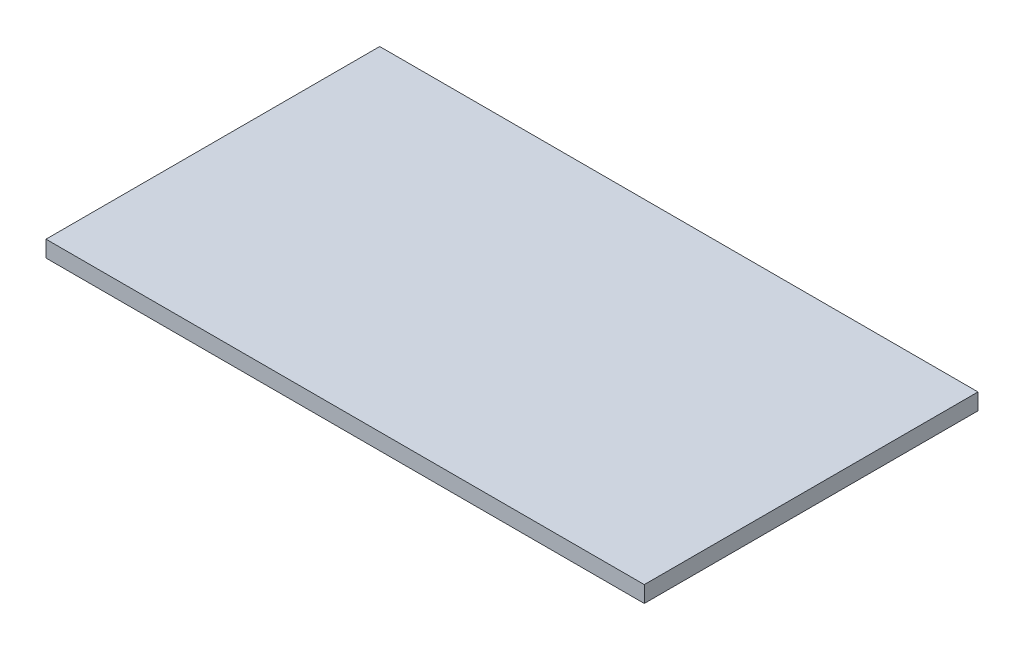
ISO-10303-21;
HEADER;
FILE_DESCRIPTION(('STEP AP214'),'2;1');
FILE_NAME('part.step','',(''),(''),'','','');
FILE_SCHEMA(('AUTOMOTIVE_DESIGN { 1 0 10303 214 1 1 1 1 }'));
ENDSEC;
DATA;
#1=APPLICATION_CONTEXT('core data for automotive mechanical design processes');
#2=APPLICATION_PROTOCOL_DEFINITION('international standard','automotive_design',2000,#1);
#3=PRODUCT_CONTEXT('',#1,'mechanical');
#4=PRODUCT('Part','Part','',(#3));
#5=PRODUCT_RELATED_PRODUCT_CATEGORY('part','',(#4));
#6=PRODUCT_DEFINITION_FORMATION('','',#4);
#7=PRODUCT_DEFINITION_CONTEXT('part definition',#1,'design');
#8=PRODUCT_DEFINITION('design','',#6,#7);
#9=PRODUCT_DEFINITION_SHAPE('','',#8);
#10=(LENGTH_UNIT() NAMED_UNIT(*) SI_UNIT(.MILLI.,.METRE.));
#11=(NAMED_UNIT(*) PLANE_ANGLE_UNIT() SI_UNIT($,.RADIAN.));
#12=(NAMED_UNIT(*) SI_UNIT($,.STERADIAN.) SOLID_ANGLE_UNIT());
#13=UNCERTAINTY_MEASURE_WITH_UNIT(LENGTH_MEASURE(1.E-05),#10,'distance_accuracy_value','');
#14=(GEOMETRIC_REPRESENTATION_CONTEXT(3) GLOBAL_UNCERTAINTY_ASSIGNED_CONTEXT((#13)) GLOBAL_UNIT_ASSIGNED_CONTEXT((#10,
#11,#12)) REPRESENTATION_CONTEXT('',''));
#15=CARTESIAN_POINT('',(0.,0.,0.));
#16=DIRECTION('',(0.,0.,1.));
#17=DIRECTION('',(1.,0.,0.));
#18=AXIS2_PLACEMENT_3D('',#15,#16,#17);
#19=CARTESIAN_POINT('',(-3.05,-4.7498711329,-0.1625));
#20=DIRECTION('',(0.,-1.,0.));
#21=DIRECTION('',(-1.,0.,0.));
#22=AXIS2_PLACEMENT_3D('',#19,#20,#21);
#23=PLANE('',#22);
#24=DIRECTION('',(0.,0.,1.));
#25=VECTOR('',#24,1.);
#26=CARTESIAN_POINT('',(63.605,-4.7498711329,-18.75125));
#27=LINE('',#26,#25);
#28=CARTESIAN_POINT('',(63.605,-4.74987113290001,-37.34));
#29=VERTEX_POINT('',#28);
#30=CARTESIAN_POINT('',(63.605,-4.7498711329,37.015));
#31=VERTEX_POINT('',#30);
#32=EDGE_CURVE('E72',#29,#31,#27,.T.);
#33=ORIENTED_EDGE('',*,*,#32,.T.);
#34=DIRECTION('',(-1.,0.,0.));
#35=VECTOR('',#34,1.);
#36=CARTESIAN_POINT('',(30.2775,-4.7498711329,37.015));
#37=LINE('',#36,#35);
#38=CARTESIAN_POINT('',(-69.705,-4.7498711329,37.015));
#39=VERTEX_POINT('',#38);
#40=EDGE_CURVE('E11',#31,#39,#37,.T.);
#41=ORIENTED_EDGE('',*,*,#40,.T.);
#42=DIRECTION('',(0.,0.,-1.));
#43=VECTOR('',#42,1.);
#44=CARTESIAN_POINT('',(-69.705,-4.7498711329,18.42625));
#45=LINE('',#44,#43);
#46=CARTESIAN_POINT('',(-69.705,-4.74987113290001,-37.34));
#47=VERTEX_POINT('',#46);
#48=EDGE_CURVE('E87',#39,#47,#45,.T.);
#49=ORIENTED_EDGE('',*,*,#48,.T.);
#50=DIRECTION('',(1.,0.,0.));
#51=VECTOR('',#50,1.);
#52=CARTESIAN_POINT('',(-36.3775,-4.74987113290001,-37.34));
#53=LINE('',#52,#51);
#54=EDGE_CURVE('E20',#47,#29,#53,.T.);
#55=ORIENTED_EDGE('',*,*,#54,.T.);
#56=EDGE_LOOP('',(#33,#41,#49,#55));
#57=FACE_BOUND('',#56,.T.);
#58=ADVANCED_FACE('F16',(#57),#23,.T.);
#59=CARTESIAN_POINT('',(63.605,-1.09987113289999,37.015));
#60=DIRECTION('',(0.,0.,1.));
#61=DIRECTION('',(1.,0.,0.));
#62=AXIS2_PLACEMENT_3D('',#59,#60,#61);
#63=PLANE('',#62);
#64=ORIENTED_EDGE('',*,*,#40,.F.);
#65=DIRECTION('',(0.,-1.,0.));
#66=VECTOR('',#65,1.);
#67=CARTESIAN_POINT('',(63.605,-1.09987113289999,37.015));
#68=LINE('',#67,#66);
#69=CARTESIAN_POINT('',(63.605,-1.09987113289999,37.015));
#70=VERTEX_POINT('',#69);
#71=EDGE_CURVE('E27',#70,#31,#68,.T.);
#72=ORIENTED_EDGE('',*,*,#71,.F.);
#73=DIRECTION('',(1.,0.,0.));
#74=VECTOR('',#73,1.);
#75=CARTESIAN_POINT('',(31.8025,-1.09987113289999,37.015));
#76=LINE('',#75,#74);
#77=CARTESIAN_POINT('',(-69.705,-1.09987113289999,37.015));
#78=VERTEX_POINT('',#77);
#79=EDGE_CURVE('E62',#78,#70,#76,.T.);
#80=ORIENTED_EDGE('',*,*,#79,.F.);
#81=DIRECTION('',(0.,-1.,0.));
#82=VECTOR('',#81,1.);
#83=CARTESIAN_POINT('',(-69.705,-1.09987113289999,37.015));
#84=LINE('',#83,#82);
#85=EDGE_CURVE('E66',#78,#39,#84,.T.);
#86=ORIENTED_EDGE('',*,*,#85,.T.);
#87=EDGE_LOOP('',(#64,#72,#80,#86));
#88=FACE_BOUND('',#87,.T.);
#89=ADVANCED_FACE('F64',(#88),#63,.T.);
#90=CARTESIAN_POINT('',(63.605,-1.0998711329,-37.34));
#91=DIRECTION('',(1.,0.,0.));
#92=DIRECTION('',(0.,0.,1.));
#93=AXIS2_PLACEMENT_3D('',#90,#91,#92);
#94=PLANE('',#93);
#95=ORIENTED_EDGE('',*,*,#32,.F.);
#96=DIRECTION('',(0.,-1.,0.));
#97=VECTOR('',#96,1.);
#98=CARTESIAN_POINT('',(63.605,-1.0998711329,-37.34));
#99=LINE('',#98,#97);
#100=CARTESIAN_POINT('',(63.605,-1.0998711329,-37.34));
#101=VERTEX_POINT('',#100);
#102=EDGE_CURVE('E98',#101,#29,#99,.T.);
#103=ORIENTED_EDGE('',*,*,#102,.F.);
#104=DIRECTION('',(0.,0.,-1.));
#105=VECTOR('',#104,1.);
#106=CARTESIAN_POINT('',(63.605,-1.0998711329,-18.67));
#107=LINE('',#106,#105);
#108=EDGE_CURVE('E73',#70,#101,#107,.T.);
#109=ORIENTED_EDGE('',*,*,#108,.F.);
#110=ORIENTED_EDGE('',*,*,#71,.T.);
#111=EDGE_LOOP('',(#95,#103,#109,#110));
#112=FACE_BOUND('',#111,.T.);
#113=ADVANCED_FACE('F118',(#112),#94,.T.);
#114=CARTESIAN_POINT('',(0.,-1.0998711329,0.));
#115=DIRECTION('',(0.,-1.,0.));
#116=DIRECTION('',(-1.,0.,0.));
#117=AXIS2_PLACEMENT_3D('',#114,#115,#116);
#118=PLANE('',#117);
#119=ORIENTED_EDGE('',*,*,#108,.T.);
#120=DIRECTION('',(-1.,0.,0.));
#121=VECTOR('',#120,1.);
#122=CARTESIAN_POINT('',(-34.8525,-1.0998711329,-37.34));
#123=LINE('',#122,#121);
#124=CARTESIAN_POINT('',(-69.705,-1.0998711329,-37.34));
#125=VERTEX_POINT('',#124);
#126=EDGE_CURVE('E79',#101,#125,#123,.T.);
#127=ORIENTED_EDGE('',*,*,#126,.T.);
#128=DIRECTION('',(0.,0.,1.));
#129=VECTOR('',#128,1.);
#130=CARTESIAN_POINT('',(-69.705,-1.0998711329,18.5075));
#131=LINE('',#130,#129);
#132=EDGE_CURVE('E76',#125,#78,#131,.T.);
#133=ORIENTED_EDGE('',*,*,#132,.T.);
#134=ORIENTED_EDGE('',*,*,#79,.T.);
#135=EDGE_LOOP('',(#119,#127,#133,#134));
#136=FACE_BOUND('',#135,.T.);
#137=ADVANCED_FACE('F77',(#136),#118,.F.);
#138=CARTESIAN_POINT('',(-69.705,-1.0998711329,-37.34));
#139=DIRECTION('',(0.,0.,-1.));
#140=DIRECTION('',(0.,-1.,0.));
#141=AXIS2_PLACEMENT_3D('',#138,#139,#140);
#142=PLANE('',#141);
#143=ORIENTED_EDGE('',*,*,#54,.F.);
#144=DIRECTION('',(0.,-1.,0.));
#145=VECTOR('',#144,1.);
#146=CARTESIAN_POINT('',(-69.705,-1.0998711329,-37.34));
#147=LINE('',#146,#145);
#148=EDGE_CURVE('E84',#125,#47,#147,.T.);
#149=ORIENTED_EDGE('',*,*,#148,.F.);
#150=ORIENTED_EDGE('',*,*,#126,.F.);
#151=ORIENTED_EDGE('',*,*,#102,.T.);
#152=EDGE_LOOP('',(#143,#149,#150,#151));
#153=FACE_BOUND('',#152,.T.);
#154=ADVANCED_FACE('F18',(#153),#142,.T.);
#155=CARTESIAN_POINT('',(-69.705,-1.09987113289999,37.015));
#156=DIRECTION('',(-1.,0.,0.));
#157=DIRECTION('',(0.,0.,1.));
#158=AXIS2_PLACEMENT_3D('',#155,#156,#157);
#159=PLANE('',#158);
#160=ORIENTED_EDGE('',*,*,#48,.F.);
#161=ORIENTED_EDGE('',*,*,#85,.F.);
#162=ORIENTED_EDGE('',*,*,#132,.F.);
#163=ORIENTED_EDGE('',*,*,#148,.T.);
#164=EDGE_LOOP('',(#160,#161,#162,#163));
#165=FACE_BOUND('',#164,.T.);
#166=ADVANCED_FACE('F85',(#165),#159,.T.);
#167=CLOSED_SHELL('',(#58,#89,#113,#137,#154,#166));
#168=MANIFOLD_SOLID_BREP('B1',#167);
#169=ADVANCED_BREP_SHAPE_REPRESENTATION('',(#18,#168),#14);
#170=SHAPE_DEFINITION_REPRESENTATION(#9,#169);
ENDSEC;
END-ISO-10303-21;
